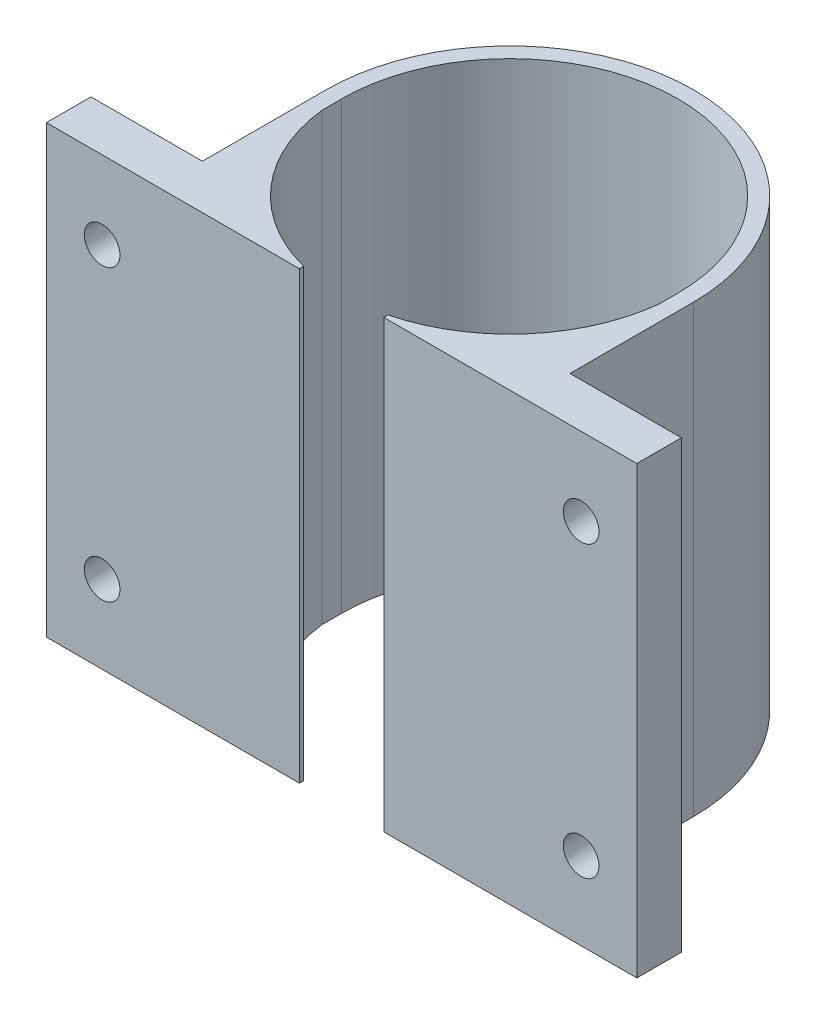
ISO-10303-21;
HEADER;
FILE_DESCRIPTION(('STEP AP214'),'2;1');
FILE_NAME('part.step','',(''),(''),'','','');
FILE_SCHEMA(('AUTOMOTIVE_DESIGN { 1 0 10303 214 1 1 1 1 }'));
ENDSEC;
DATA;
#1=APPLICATION_CONTEXT('core data for automotive mechanical design processes');
#2=APPLICATION_PROTOCOL_DEFINITION('international standard','automotive_design',2000,#1);
#3=PRODUCT_CONTEXT('',#1,'mechanical');
#4=PRODUCT('Part','Part','',(#3));
#5=PRODUCT_RELATED_PRODUCT_CATEGORY('part','',(#4));
#6=PRODUCT_DEFINITION_FORMATION('','',#4);
#7=PRODUCT_DEFINITION_CONTEXT('part definition',#1,'design');
#8=PRODUCT_DEFINITION('design','',#6,#7);
#9=PRODUCT_DEFINITION_SHAPE('','',#8);
#10=(LENGTH_UNIT() NAMED_UNIT(*) SI_UNIT(.MILLI.,.METRE.));
#11=(NAMED_UNIT(*) PLANE_ANGLE_UNIT() SI_UNIT($,.RADIAN.));
#12=(NAMED_UNIT(*) SI_UNIT($,.STERADIAN.) SOLID_ANGLE_UNIT());
#13=UNCERTAINTY_MEASURE_WITH_UNIT(LENGTH_MEASURE(1.E-05),#10,'distance_accuracy_value','');
#14=(GEOMETRIC_REPRESENTATION_CONTEXT(3) GLOBAL_UNCERTAINTY_ASSIGNED_CONTEXT((#13)) GLOBAL_UNIT_ASSIGNED_CONTEXT((#10,
#11,#12)) REPRESENTATION_CONTEXT('',''));
#15=CARTESIAN_POINT('',(0.,0.,0.));
#16=DIRECTION('',(0.,0.,1.));
#17=DIRECTION('',(1.,0.,0.));
#18=AXIS2_PLACEMENT_3D('',#15,#16,#17);
#19=CARTESIAN_POINT('',(-15.1,40.,0.));
#20=DIRECTION('',(1.,0.,0.));
#21=DIRECTION('',(0.,0.,-1.));
#22=AXIS2_PLACEMENT_3D('',#19,#20,#21);
#23=PLANE('',#22);
#24=DIRECTION('',(0.,0.,1.));
#25=VECTOR('',#24,1.);
#26=CARTESIAN_POINT('',(-15.1,40.,0.));
#27=LINE('',#26,#25);
#28=CARTESIAN_POINT('',(-15.1,40.,0.));
#29=VERTEX_POINT('',#28);
#30=CARTESIAN_POINT('',(-15.1,40.,1.74068951855294));
#31=VERTEX_POINT('',#30);
#32=EDGE_CURVE('E258',#29,#31,#27,.T.);
#33=ORIENTED_EDGE('',*,*,#32,.T.);
#34=DIRECTION('',(0.,-1.,0.));
#35=VECTOR('',#34,1.);
#36=CARTESIAN_POINT('',(-15.1,40.,1.74068951855294));
#37=LINE('',#36,#35);
#38=CARTESIAN_POINT('',(-15.1,0.,1.74068951855294));
#39=VERTEX_POINT('',#38);
#40=EDGE_CURVE('E180',#31,#39,#37,.T.);
#41=ORIENTED_EDGE('',*,*,#40,.T.);
#42=DIRECTION('',(0.,0.,1.));
#43=VECTOR('',#42,1.);
#44=CARTESIAN_POINT('',(-15.1,0.,0.));
#45=LINE('',#44,#43);
#46=CARTESIAN_POINT('',(-15.1,0.,0.));
#47=VERTEX_POINT('',#46);
#48=EDGE_CURVE('E275',#47,#39,#45,.T.);
#49=ORIENTED_EDGE('',*,*,#48,.F.);
#50=DIRECTION('',(0.,-1.,0.));
#51=VECTOR('',#50,1.);
#52=CARTESIAN_POINT('',(-15.1,40.,0.));
#53=LINE('',#52,#51);
#54=EDGE_CURVE('E284',#29,#47,#53,.T.);
#55=ORIENTED_EDGE('',*,*,#54,.F.);
#56=EDGE_LOOP('',(#33,#41,#49,#55));
#57=FACE_BOUND('',#56,.T.);
#58=ADVANCED_FACE('F45',(#57),#23,.T.);
#59=CARTESIAN_POINT('',(-16.5,40.,0.));
#60=DIRECTION('',(1.,0.,0.));
#61=DIRECTION('',(0.,0.,-1.));
#62=AXIS2_PLACEMENT_3D('',#59,#60,#61);
#63=PLANE('',#62);
#64=DIRECTION('',(0.,-1.,0.));
#65=VECTOR('',#64,1.);
#66=CARTESIAN_POINT('',(-16.5,40.,11.1));
#67=LINE('',#66,#65);
#68=CARTESIAN_POINT('',(-16.5,40.,11.1));
#69=VERTEX_POINT('',#68);
#70=CARTESIAN_POINT('',(-16.5,0.,11.1));
#71=VERTEX_POINT('',#70);
#72=EDGE_CURVE('E208',#69,#71,#67,.T.);
#73=ORIENTED_EDGE('',*,*,#72,.F.);
#74=DIRECTION('',(0.,0.,1.));
#75=VECTOR('',#74,1.);
#76=CARTESIAN_POINT('',(-16.5,40.,0.));
#77=LINE('',#76,#75);
#78=CARTESIAN_POINT('',(-16.5,40.,0.));
#79=VERTEX_POINT('',#78);
#80=EDGE_CURVE('E254',#79,#69,#77,.T.);
#81=ORIENTED_EDGE('',*,*,#80,.F.);
#82=DIRECTION('',(0.,-1.,0.));
#83=VECTOR('',#82,1.);
#84=CARTESIAN_POINT('',(-16.5,40.,0.));
#85=LINE('',#84,#83);
#86=CARTESIAN_POINT('',(-16.5,0.,0.));
#87=VERTEX_POINT('',#86);
#88=EDGE_CURVE('E53',#79,#87,#85,.T.);
#89=ORIENTED_EDGE('',*,*,#88,.T.);
#90=DIRECTION('',(0.,0.,1.));
#91=VECTOR('',#90,1.);
#92=CARTESIAN_POINT('',(-16.5,0.,0.));
#93=LINE('',#92,#91);
#94=EDGE_CURVE('E271',#87,#71,#93,.T.);
#95=ORIENTED_EDGE('',*,*,#94,.T.);
#96=EDGE_LOOP('',(#73,#81,#89,#95));
#97=FACE_BOUND('',#96,.T.);
#98=ADVANCED_FACE('F290',(#97),#63,.F.);
#99=CARTESIAN_POINT('',(16.5,40.,0.));
#100=DIRECTION('',(-1.,0.,0.));
#101=DIRECTION('',(0.,0.,1.));
#102=AXIS2_PLACEMENT_3D('',#99,#100,#101);
#103=PLANE('',#102);
#104=DIRECTION('',(0.,1.,0.));
#105=VECTOR('',#104,1.);
#106=CARTESIAN_POINT('',(16.5,0.,11.1));
#107=LINE('',#106,#105);
#108=CARTESIAN_POINT('',(16.5,0.,11.1));
#109=VERTEX_POINT('',#108);
#110=CARTESIAN_POINT('',(16.5,40.,11.1));
#111=VERTEX_POINT('',#110);
#112=EDGE_CURVE('E229',#109,#111,#107,.T.);
#113=ORIENTED_EDGE('',*,*,#112,.F.);
#114=DIRECTION('',(0.,0.,-1.));
#115=VECTOR('',#114,1.);
#116=CARTESIAN_POINT('',(16.5,0.,0.));
#117=LINE('',#116,#115);
#118=CARTESIAN_POINT('',(16.5,0.,0.));
#119=VERTEX_POINT('',#118);
#120=EDGE_CURVE('E248',#109,#119,#117,.T.);
#121=ORIENTED_EDGE('',*,*,#120,.T.);
#122=DIRECTION('',(0.,-1.,0.));
#123=VECTOR('',#122,1.);
#124=CARTESIAN_POINT('',(16.5,40.,0.));
#125=LINE('',#124,#123);
#126=CARTESIAN_POINT('',(16.5,40.,0.));
#127=VERTEX_POINT('',#126);
#128=EDGE_CURVE('E12',#127,#119,#125,.T.);
#129=ORIENTED_EDGE('',*,*,#128,.F.);
#130=DIRECTION('',(0.,0.,-1.));
#131=VECTOR('',#130,1.);
#132=CARTESIAN_POINT('',(16.5,40.,0.));
#133=LINE('',#132,#131);
#134=EDGE_CURVE('E249',#111,#127,#133,.T.);
#135=ORIENTED_EDGE('',*,*,#134,.F.);
#136=EDGE_LOOP('',(#113,#121,#129,#135));
#137=FACE_BOUND('',#136,.T.);
#138=ADVANCED_FACE('F47',(#137),#103,.F.);
#139=CARTESIAN_POINT('',(0.,40.,0.));
#140=DIRECTION('',(0.,-1.,0.));
#141=DIRECTION('',(0.,0.,-1.));
#142=AXIS2_PLACEMENT_3D('',#139,#140,#141);
#143=CYLINDRICAL_SURFACE('',#142,16.5);
#144=CARTESIAN_POINT('',(0.,0.,0.));
#145=DIRECTION('',(0.,1.,0.));
#146=DIRECTION('',(0.,0.,1.));
#147=AXIS2_PLACEMENT_3D('',#144,#145,#146);
#148=CIRCLE('',#147,16.5);
#149=EDGE_CURVE('E269',#119,#87,#148,.T.);
#150=ORIENTED_EDGE('',*,*,#149,.T.);
#151=ORIENTED_EDGE('',*,*,#88,.F.);
#152=CARTESIAN_POINT('',(0.,40.,0.));
#153=DIRECTION('',(0.,1.,0.));
#154=DIRECTION('',(0.,0.,1.));
#155=AXIS2_PLACEMENT_3D('',#152,#153,#154);
#156=CIRCLE('',#155,16.5);
#157=EDGE_CURVE('E251',#127,#79,#156,.T.);
#158=ORIENTED_EDGE('',*,*,#157,.F.);
#159=ORIENTED_EDGE('',*,*,#128,.T.);
#160=EDGE_LOOP('',(#150,#151,#158,#159));
#161=FACE_BOUND('',#160,.T.);
#162=ADVANCED_FACE('F303',(#161),#143,.T.);
#163=CARTESIAN_POINT('',(0.,40.,15.1));
#164=DIRECTION('',(0.,0.,1.));
#165=DIRECTION('',(1.,0.,0.));
#166=AXIS2_PLACEMENT_3D('',#163,#164,#165);
#167=PLANE('',#166);
#168=CARTESIAN_POINT('',(-21.5,7.,15.1));
#169=DIRECTION('',(0.,0.,1.));
#170=DIRECTION('',(1.,0.,0.));
#171=AXIS2_PLACEMENT_3D('',#168,#169,#170);
#172=CIRCLE('',#171,1.6);
#173=CARTESIAN_POINT('',(-19.9,7.,15.1));
#174=VERTEX_POINT('',#173);
#175=EDGE_CURVE('E402',#174,#174,#172,.T.);
#176=ORIENTED_EDGE('',*,*,#175,.F.);
#177=EDGE_LOOP('',(#176));
#178=FACE_BOUND('',#177,.T.);
#179=CARTESIAN_POINT('',(-21.5,33.,15.1));
#180=DIRECTION('',(0.,0.,1.));
#181=DIRECTION('',(1.,0.,0.));
#182=AXIS2_PLACEMENT_3D('',#179,#180,#181);
#183=CIRCLE('',#182,1.6);
#184=CARTESIAN_POINT('',(-19.9,33.,15.1));
#185=VERTEX_POINT('',#184);
#186=EDGE_CURVE('E410',#185,#185,#183,.T.);
#187=ORIENTED_EDGE('',*,*,#186,.F.);
#188=EDGE_LOOP('',(#187));
#189=FACE_BOUND('',#188,.T.);
#190=DIRECTION('',(-1.,0.,0.));
#191=VECTOR('',#190,1.);
#192=CARTESIAN_POINT('',(0.,0.,15.1));
#193=LINE('',#192,#191);
#194=CARTESIAN_POINT('',(-3.79133270865897,0.,15.1));
#195=VERTEX_POINT('',#194);
#196=CARTESIAN_POINT('',(-26.5,0.,15.1));
#197=VERTEX_POINT('',#196);
#198=EDGE_CURVE('E273',#195,#197,#193,.T.);
#199=ORIENTED_EDGE('',*,*,#198,.F.);
#200=DIRECTION('',(0.,-1.,0.));
#201=VECTOR('',#200,1.);
#202=CARTESIAN_POINT('',(-3.79133270865897,40.,15.1));
#203=LINE('',#202,#201);
#204=CARTESIAN_POINT('',(-3.79133270865897,40.,15.1));
#205=VERTEX_POINT('',#204);
#206=EDGE_CURVE('E176',#205,#195,#203,.T.);
#207=ORIENTED_EDGE('',*,*,#206,.F.);
#208=DIRECTION('',(-1.,0.,0.));
#209=VECTOR('',#208,1.);
#210=CARTESIAN_POINT('',(0.,40.,15.1));
#211=LINE('',#210,#209);
#212=CARTESIAN_POINT('',(-26.5,40.,15.1));
#213=VERTEX_POINT('',#212);
#214=EDGE_CURVE('E164',#205,#213,#211,.T.);
#215=ORIENTED_EDGE('',*,*,#214,.T.);
#216=DIRECTION('',(0.,1.,0.));
#217=VECTOR('',#216,1.);
#218=CARTESIAN_POINT('',(-26.5,40.,15.1));
#219=LINE('',#218,#217);
#220=EDGE_CURVE('E211',#197,#213,#219,.T.);
#221=ORIENTED_EDGE('',*,*,#220,.F.);
#222=EDGE_LOOP('',(#199,#207,#215,#221));
#223=FACE_BOUND('',#222,.T.);
#224=ADVANCED_FACE('F338',(#178,#189,#223),#167,.T.);
#225=CARTESIAN_POINT('',(0.,40.,0.));
#226=DIRECTION('',(0.,-1.,0.));
#227=DIRECTION('',(0.,0.,-1.));
#228=AXIS2_PLACEMENT_3D('',#225,#226,#227);
#229=CYLINDRICAL_SURFACE('',#228,15.1);
#230=CARTESIAN_POINT('',(0.,0.,0.));
#231=DIRECTION('',(0.,1.,0.));
#232=DIRECTION('',(0.,0.,1.));
#233=AXIS2_PLACEMENT_3D('',#230,#231,#232);
#234=CIRCLE('',#233,15.1);
#235=CARTESIAN_POINT('',(15.1,0.,0.));
#236=VERTEX_POINT('',#235);
#237=EDGE_CURVE('E278',#236,#47,#234,.T.);
#238=ORIENTED_EDGE('',*,*,#237,.F.);
#239=DIRECTION('',(0.,-1.,0.));
#240=VECTOR('',#239,1.);
#241=CARTESIAN_POINT('',(15.1,40.,0.));
#242=LINE('',#241,#240);
#243=CARTESIAN_POINT('',(15.1,40.,0.));
#244=VERTEX_POINT('',#243);
#245=EDGE_CURVE('E267',#244,#236,#242,.T.);
#246=ORIENTED_EDGE('',*,*,#245,.F.);
#247=CARTESIAN_POINT('',(0.,40.,0.));
#248=DIRECTION('',(0.,1.,0.));
#249=DIRECTION('',(0.,0.,1.));
#250=AXIS2_PLACEMENT_3D('',#247,#248,#249);
#251=CIRCLE('',#250,15.1);
#252=EDGE_CURVE('E260',#244,#29,#251,.T.);
#253=ORIENTED_EDGE('',*,*,#252,.T.);
#254=ORIENTED_EDGE('',*,*,#54,.T.);
#255=EDGE_LOOP('',(#238,#246,#253,#254));
#256=FACE_BOUND('',#255,.T.);
#257=ADVANCED_FACE('F331',(#256),#229,.F.);
#258=CARTESIAN_POINT('',(15.1,40.,0.));
#259=DIRECTION('',(1.,0.,0.));
#260=DIRECTION('',(0.,0.,-1.));
#261=AXIS2_PLACEMENT_3D('',#258,#259,#260);
#262=PLANE('',#261);
#263=DIRECTION('',(0.,0.,1.));
#264=VECTOR('',#263,1.);
#265=CARTESIAN_POINT('',(15.1,0.,0.));
#266=LINE('',#265,#264);
#267=CARTESIAN_POINT('',(15.1,0.,1.74068951855292));
#268=VERTEX_POINT('',#267);
#269=EDGE_CURVE('E65',#236,#268,#266,.T.);
#270=ORIENTED_EDGE('',*,*,#269,.T.);
#271=DIRECTION('',(0.,-1.,0.));
#272=VECTOR('',#271,1.);
#273=CARTESIAN_POINT('',(15.1,40.,1.74068951855294));
#274=LINE('',#273,#272);
#275=CARTESIAN_POINT('',(15.1,40.,1.74068951855292));
#276=VERTEX_POINT('',#275);
#277=EDGE_CURVE('E60',#276,#268,#274,.T.);
#278=ORIENTED_EDGE('',*,*,#277,.F.);
#279=DIRECTION('',(0.,0.,1.));
#280=VECTOR('',#279,1.);
#281=CARTESIAN_POINT('',(15.1,40.,0.));
#282=LINE('',#281,#280);
#283=EDGE_CURVE('E263',#244,#276,#282,.T.);
#284=ORIENTED_EDGE('',*,*,#283,.F.);
#285=ORIENTED_EDGE('',*,*,#245,.T.);
#286=EDGE_LOOP('',(#270,#278,#284,#285));
#287=FACE_BOUND('',#286,.T.);
#288=ADVANCED_FACE('F328',(#287),#262,.F.);
#289=CARTESIAN_POINT('',(0.,40.,15.1));
#290=DIRECTION('',(0.,0.,-1.));
#291=DIRECTION('',(-1.,0.,0.));
#292=AXIS2_PLACEMENT_3D('',#289,#290,#291);
#293=PLANE('',#292);
#294=CARTESIAN_POINT('',(21.5,33.,15.1));
#295=DIRECTION('',(0.,0.,-1.));
#296=DIRECTION('',(-1.,0.,0.));
#297=AXIS2_PLACEMENT_3D('',#294,#295,#296);
#298=CIRCLE('',#297,1.6);
#299=CARTESIAN_POINT('',(19.9,33.,15.1));
#300=VERTEX_POINT('',#299);
#301=EDGE_CURVE('E186',#300,#300,#298,.T.);
#302=ORIENTED_EDGE('',*,*,#301,.T.);
#303=EDGE_LOOP('',(#302));
#304=FACE_BOUND('',#303,.T.);
#305=CARTESIAN_POINT('',(21.5,7.,15.1));
#306=DIRECTION('',(0.,0.,-1.));
#307=DIRECTION('',(-1.,0.,0.));
#308=AXIS2_PLACEMENT_3D('',#305,#306,#307);
#309=CIRCLE('',#308,1.6);
#310=CARTESIAN_POINT('',(19.9,7.,15.1));
#311=VERTEX_POINT('',#310);
#312=EDGE_CURVE('E420',#311,#311,#309,.T.);
#313=ORIENTED_EDGE('',*,*,#312,.T.);
#314=EDGE_LOOP('',(#313));
#315=FACE_BOUND('',#314,.T.);
#316=DIRECTION('',(1.,0.,0.));
#317=VECTOR('',#316,1.);
#318=CARTESIAN_POINT('',(0.,0.,15.1));
#319=LINE('',#318,#317);
#320=CARTESIAN_POINT('',(3.79133270865898,0.,15.1));
#321=VERTEX_POINT('',#320);
#322=CARTESIAN_POINT('',(26.5,0.,15.1));
#323=VERTEX_POINT('',#322);
#324=EDGE_CURVE('E252',#321,#323,#319,.T.);
#325=ORIENTED_EDGE('',*,*,#324,.T.);
#326=DIRECTION('',(0.,-1.,0.));
#327=VECTOR('',#326,1.);
#328=CARTESIAN_POINT('',(26.5,0.,15.1));
#329=LINE('',#328,#327);
#330=CARTESIAN_POINT('',(26.5,40.,15.1));
#331=VERTEX_POINT('',#330);
#332=EDGE_CURVE('E230',#331,#323,#329,.T.);
#333=ORIENTED_EDGE('',*,*,#332,.F.);
#334=DIRECTION('',(1.,0.,0.));
#335=VECTOR('',#334,1.);
#336=CARTESIAN_POINT('',(0.,40.,15.1));
#337=LINE('',#336,#335);
#338=CARTESIAN_POINT('',(3.79133270865898,40.,15.1));
#339=VERTEX_POINT('',#338);
#340=EDGE_CURVE('E265',#339,#331,#337,.T.);
#341=ORIENTED_EDGE('',*,*,#340,.F.);
#342=DIRECTION('',(0.,-1.,0.));
#343=VECTOR('',#342,1.);
#344=CARTESIAN_POINT('',(3.79133270865898,40.,15.1));
#345=LINE('',#344,#343);
#346=EDGE_CURVE('E205',#339,#321,#345,.T.);
#347=ORIENTED_EDGE('',*,*,#346,.T.);
#348=EDGE_LOOP('',(#325,#333,#341,#347));
#349=FACE_BOUND('',#348,.T.);
#350=ADVANCED_FACE('F317',(#304,#315,#349),#293,.F.);
#351=CARTESIAN_POINT('',(0.,40.,0.));
#352=DIRECTION('',(0.,1.,0.));
#353=DIRECTION('',(0.,0.,1.));
#354=AXIS2_PLACEMENT_3D('',#351,#352,#353);
#355=PLANE('',#354);
#356=ORIENTED_EDGE('',*,*,#340,.T.);
#357=DIRECTION('',(0.,0.,1.));
#358=VECTOR('',#357,1.);
#359=CARTESIAN_POINT('',(26.5,40.,15.1));
#360=LINE('',#359,#358);
#361=CARTESIAN_POINT('',(26.5,40.,11.1));
#362=VERTEX_POINT('',#361);
#363=EDGE_CURVE('E237',#362,#331,#360,.T.);
#364=ORIENTED_EDGE('',*,*,#363,.F.);
#365=DIRECTION('',(-1.,0.,0.));
#366=VECTOR('',#365,1.);
#367=CARTESIAN_POINT('',(26.5,40.,11.1));
#368=LINE('',#367,#366);
#369=EDGE_CURVE('E240',#362,#111,#368,.T.);
#370=ORIENTED_EDGE('',*,*,#369,.T.);
#371=ORIENTED_EDGE('',*,*,#134,.T.);
#372=ORIENTED_EDGE('',*,*,#157,.T.);
#373=ORIENTED_EDGE('',*,*,#80,.T.);
#374=DIRECTION('',(1.,0.,0.));
#375=VECTOR('',#374,1.);
#376=CARTESIAN_POINT('',(-26.5,40.,11.1));
#377=LINE('',#376,#375);
#378=CARTESIAN_POINT('',(-26.5,40.,11.1));
#379=VERTEX_POINT('',#378);
#380=EDGE_CURVE('E226',#379,#69,#377,.T.);
#381=ORIENTED_EDGE('',*,*,#380,.F.);
#382=DIRECTION('',(0.,0.,-1.));
#383=VECTOR('',#382,1.);
#384=CARTESIAN_POINT('',(-26.5,40.,15.1));
#385=LINE('',#384,#383);
#386=EDGE_CURVE('E214',#213,#379,#385,.T.);
#387=ORIENTED_EDGE('',*,*,#386,.F.);
#388=ORIENTED_EDGE('',*,*,#214,.F.);
#389=DIRECTION('',(0.,0.,-1.));
#390=VECTOR('',#389,1.);
#391=CARTESIAN_POINT('',(-3.79133270865897,40.,0.));
#392=LINE('',#391,#390);
#393=CARTESIAN_POINT('',(-3.79133270865897,40.,14.7195718787012));
#394=VERTEX_POINT('',#393);
#395=EDGE_CURVE('E156',#205,#394,#392,.T.);
#396=ORIENTED_EDGE('',*,*,#395,.T.);
#397=CARTESIAN_POINT('',(0.,40.,0.));
#398=DIRECTION('',(0.,-1.,0.));
#399=DIRECTION('',(0.,0.,-1.));
#400=AXIS2_PLACEMENT_3D('',#397,#398,#399);
#401=CIRCLE('',#400,15.2);
#402=EDGE_CURVE('E161',#394,#31,#401,.T.);
#403=ORIENTED_EDGE('',*,*,#402,.T.);
#404=ORIENTED_EDGE('',*,*,#32,.F.);
#405=ORIENTED_EDGE('',*,*,#252,.F.);
#406=ORIENTED_EDGE('',*,*,#283,.T.);
#407=CARTESIAN_POINT('',(0.,40.,0.));
#408=DIRECTION('',(0.,-1.,0.));
#409=DIRECTION('',(0.,0.,-1.));
#410=AXIS2_PLACEMENT_3D('',#407,#408,#409);
#411=CIRCLE('',#410,15.2);
#412=CARTESIAN_POINT('',(3.79133270865898,40.,14.7195718787012));
#413=VERTEX_POINT('',#412);
#414=EDGE_CURVE('E196',#413,#276,#411,.F.);
#415=ORIENTED_EDGE('',*,*,#414,.F.);
#416=DIRECTION('',(0.,0.,-1.));
#417=VECTOR('',#416,1.);
#418=CARTESIAN_POINT('',(3.79133270865898,40.,0.));
#419=LINE('',#418,#417);
#420=EDGE_CURVE('E193',#339,#413,#419,.T.);
#421=ORIENTED_EDGE('',*,*,#420,.F.);
#422=EDGE_LOOP('',(#356,#364,#370,#371,#372,#373,#381,#387,#388,#396,#403,#404,#405,#406,#415,#421));
#423=FACE_BOUND('',#422,.T.);
#424=ADVANCED_FACE('F158',(#423),#355,.T.);
#425=CARTESIAN_POINT('',(0.,0.,0.));
#426=DIRECTION('',(0.,1.,0.));
#427=DIRECTION('',(0.,0.,1.));
#428=AXIS2_PLACEMENT_3D('',#425,#426,#427);
#429=PLANE('',#428);
#430=ORIENTED_EDGE('',*,*,#120,.F.);
#431=DIRECTION('',(-1.,0.,0.));
#432=VECTOR('',#431,1.);
#433=CARTESIAN_POINT('',(26.5,0.,11.1));
#434=LINE('',#433,#432);
#435=CARTESIAN_POINT('',(26.5,0.,11.1));
#436=VERTEX_POINT('',#435);
#437=EDGE_CURVE('E245',#436,#109,#434,.T.);
#438=ORIENTED_EDGE('',*,*,#437,.F.);
#439=DIRECTION('',(0.,0.,-1.));
#440=VECTOR('',#439,1.);
#441=CARTESIAN_POINT('',(26.5,0.,15.1));
#442=LINE('',#441,#440);
#443=EDGE_CURVE('E233',#323,#436,#442,.T.);
#444=ORIENTED_EDGE('',*,*,#443,.F.);
#445=ORIENTED_EDGE('',*,*,#324,.F.);
#446=DIRECTION('',(0.,0.,-1.));
#447=VECTOR('',#446,1.);
#448=CARTESIAN_POINT('',(3.79133270865898,0.,0.));
#449=LINE('',#448,#447);
#450=CARTESIAN_POINT('',(3.79133270865898,0.,14.7195718787012));
#451=VERTEX_POINT('',#450);
#452=EDGE_CURVE('E191',#321,#451,#449,.T.);
#453=ORIENTED_EDGE('',*,*,#452,.T.);
#454=CARTESIAN_POINT('',(0.,0.,0.));
#455=DIRECTION('',(0.,-1.,0.));
#456=DIRECTION('',(0.,0.,-1.));
#457=AXIS2_PLACEMENT_3D('',#454,#455,#456);
#458=CIRCLE('',#457,15.2);
#459=EDGE_CURVE('E197',#451,#268,#458,.F.);
#460=ORIENTED_EDGE('',*,*,#459,.T.);
#461=ORIENTED_EDGE('',*,*,#269,.F.);
#462=ORIENTED_EDGE('',*,*,#237,.T.);
#463=ORIENTED_EDGE('',*,*,#48,.T.);
#464=CARTESIAN_POINT('',(0.,0.,0.));
#465=DIRECTION('',(0.,-1.,0.));
#466=DIRECTION('',(0.,0.,-1.));
#467=AXIS2_PLACEMENT_3D('',#464,#465,#466);
#468=CIRCLE('',#467,15.2);
#469=CARTESIAN_POINT('',(-3.79133270865897,0.,14.7195718787012));
#470=VERTEX_POINT('',#469);
#471=EDGE_CURVE('E183',#470,#39,#468,.T.);
#472=ORIENTED_EDGE('',*,*,#471,.F.);
#473=DIRECTION('',(0.,0.,-1.));
#474=VECTOR('',#473,1.);
#475=CARTESIAN_POINT('',(-3.79133270865897,0.,0.));
#476=LINE('',#475,#474);
#477=EDGE_CURVE('E173',#195,#470,#476,.T.);
#478=ORIENTED_EDGE('',*,*,#477,.F.);
#479=ORIENTED_EDGE('',*,*,#198,.T.);
#480=DIRECTION('',(0.,0.,1.));
#481=VECTOR('',#480,1.);
#482=CARTESIAN_POINT('',(-26.5,0.,15.1));
#483=LINE('',#482,#481);
#484=CARTESIAN_POINT('',(-26.5,0.,11.1));
#485=VERTEX_POINT('',#484);
#486=EDGE_CURVE('E218',#485,#197,#483,.T.);
#487=ORIENTED_EDGE('',*,*,#486,.F.);
#488=DIRECTION('',(1.,0.,0.));
#489=VECTOR('',#488,1.);
#490=CARTESIAN_POINT('',(-26.5,0.,11.1));
#491=LINE('',#490,#489);
#492=EDGE_CURVE('E221',#485,#71,#491,.T.);
#493=ORIENTED_EDGE('',*,*,#492,.T.);
#494=ORIENTED_EDGE('',*,*,#94,.F.);
#495=ORIENTED_EDGE('',*,*,#149,.F.);
#496=EDGE_LOOP('',(#430,#438,#444,#445,#453,#460,#461,#462,#463,#472,#478,#479,#487,#493,#494,#495));
#497=FACE_BOUND('',#496,.T.);
#498=ADVANCED_FACE('F295',(#497),#429,.F.);
#499=CARTESIAN_POINT('',(26.5,0.,11.1));
#500=DIRECTION('',(0.,0.,1.));
#501=DIRECTION('',(1.,0.,0.));
#502=AXIS2_PLACEMENT_3D('',#499,#500,#501);
#503=PLANE('',#502);
#504=CARTESIAN_POINT('',(21.5,33.,11.1));
#505=DIRECTION('',(0.,0.,-1.));
#506=DIRECTION('',(-1.,0.,0.));
#507=AXIS2_PLACEMENT_3D('',#504,#505,#506);
#508=CIRCLE('',#507,1.6);
#509=CARTESIAN_POINT('',(19.9,33.,11.1));
#510=VERTEX_POINT('',#509);
#511=EDGE_CURVE('E413',#510,#510,#508,.T.);
#512=ORIENTED_EDGE('',*,*,#511,.F.);
#513=EDGE_LOOP('',(#512));
#514=FACE_BOUND('',#513,.T.);
#515=CARTESIAN_POINT('',(21.5,7.,11.1));
#516=DIRECTION('',(0.,0.,-1.));
#517=DIRECTION('',(-1.,0.,0.));
#518=AXIS2_PLACEMENT_3D('',#515,#516,#517);
#519=CIRCLE('',#518,1.6);
#520=CARTESIAN_POINT('',(19.9,7.,11.1));
#521=VERTEX_POINT('',#520);
#522=EDGE_CURVE('E407',#521,#521,#519,.T.);
#523=ORIENTED_EDGE('',*,*,#522,.F.);
#524=EDGE_LOOP('',(#523));
#525=FACE_BOUND('',#524,.T.);
#526=ORIENTED_EDGE('',*,*,#112,.T.);
#527=ORIENTED_EDGE('',*,*,#369,.F.);
#528=DIRECTION('',(0.,1.,0.));
#529=VECTOR('',#528,1.);
#530=CARTESIAN_POINT('',(26.5,0.,11.1));
#531=LINE('',#530,#529);
#532=EDGE_CURVE('E235',#436,#362,#531,.T.);
#533=ORIENTED_EDGE('',*,*,#532,.F.);
#534=ORIENTED_EDGE('',*,*,#437,.T.);
#535=EDGE_LOOP('',(#526,#527,#533,#534));
#536=FACE_BOUND('',#535,.T.);
#537=ADVANCED_FACE('F311',(#514,#525,#536),#503,.F.);
#538=CARTESIAN_POINT('',(26.5,0.,0.));
#539=DIRECTION('',(-1.,0.,0.));
#540=DIRECTION('',(0.,0.,1.));
#541=AXIS2_PLACEMENT_3D('',#538,#539,#540);
#542=PLANE('',#541);
#543=ORIENTED_EDGE('',*,*,#332,.T.);
#544=ORIENTED_EDGE('',*,*,#443,.T.);
#545=ORIENTED_EDGE('',*,*,#532,.T.);
#546=ORIENTED_EDGE('',*,*,#363,.T.);
#547=EDGE_LOOP('',(#543,#544,#545,#546));
#548=FACE_BOUND('',#547,.T.);
#549=ADVANCED_FACE('F314',(#548),#542,.F.);
#550=CARTESIAN_POINT('',(-26.5,40.,11.1));
#551=DIRECTION('',(0.,0.,1.));
#552=DIRECTION('',(0.,-1.,0.));
#553=AXIS2_PLACEMENT_3D('',#550,#551,#552);
#554=PLANE('',#553);
#555=CARTESIAN_POINT('',(-21.5,7.,11.1));
#556=DIRECTION('',(0.,0.,-1.));
#557=DIRECTION('',(-1.,0.,0.));
#558=AXIS2_PLACEMENT_3D('',#555,#556,#557);
#559=CIRCLE('',#558,1.6);
#560=CARTESIAN_POINT('',(-23.1,7.,11.1));
#561=VERTEX_POINT('',#560);
#562=EDGE_CURVE('E405',#561,#561,#559,.T.);
#563=ORIENTED_EDGE('',*,*,#562,.F.);
#564=EDGE_LOOP('',(#563));
#565=FACE_BOUND('',#564,.T.);
#566=CARTESIAN_POINT('',(-21.5,33.,11.1));
#567=DIRECTION('',(0.,0.,-1.));
#568=DIRECTION('',(-1.,0.,0.));
#569=AXIS2_PLACEMENT_3D('',#566,#567,#568);
#570=CIRCLE('',#569,1.6);
#571=CARTESIAN_POINT('',(-23.1,33.,11.1));
#572=VERTEX_POINT('',#571);
#573=EDGE_CURVE('E406',#572,#572,#570,.T.);
#574=ORIENTED_EDGE('',*,*,#573,.F.);
#575=EDGE_LOOP('',(#574));
#576=FACE_BOUND('',#575,.T.);
#577=ORIENTED_EDGE('',*,*,#72,.T.);
#578=ORIENTED_EDGE('',*,*,#492,.F.);
#579=DIRECTION('',(0.,-1.,0.));
#580=VECTOR('',#579,1.);
#581=CARTESIAN_POINT('',(-26.5,40.,11.1));
#582=LINE('',#581,#580);
#583=EDGE_CURVE('E216',#379,#485,#582,.T.);
#584=ORIENTED_EDGE('',*,*,#583,.F.);
#585=ORIENTED_EDGE('',*,*,#380,.T.);
#586=EDGE_LOOP('',(#577,#578,#584,#585));
#587=FACE_BOUND('',#586,.T.);
#588=ADVANCED_FACE('F300',(#565,#576,#587),#554,.F.);
#589=CARTESIAN_POINT('',(-26.5,0.,0.));
#590=DIRECTION('',(1.,0.,0.));
#591=DIRECTION('',(0.,0.,-1.));
#592=AXIS2_PLACEMENT_3D('',#589,#590,#591);
#593=PLANE('',#592);
#594=ORIENTED_EDGE('',*,*,#220,.T.);
#595=ORIENTED_EDGE('',*,*,#386,.T.);
#596=ORIENTED_EDGE('',*,*,#583,.T.);
#597=ORIENTED_EDGE('',*,*,#486,.T.);
#598=EDGE_LOOP('',(#594,#595,#596,#597));
#599=FACE_BOUND('',#598,.T.);
#600=ADVANCED_FACE('F337',(#599),#593,.F.);
#601=CARTESIAN_POINT('',(3.79133270865898,40.,0.));
#602=DIRECTION('',(-1.,0.,0.));
#603=DIRECTION('',(0.,0.,1.));
#604=AXIS2_PLACEMENT_3D('',#601,#602,#603);
#605=PLANE('',#604);
#606=ORIENTED_EDGE('',*,*,#452,.F.);
#607=ORIENTED_EDGE('',*,*,#346,.F.);
#608=ORIENTED_EDGE('',*,*,#420,.T.);
#609=DIRECTION('',(0.,-1.,0.));
#610=VECTOR('',#609,1.);
#611=CARTESIAN_POINT('',(3.79133270865898,40.,14.7195718787012));
#612=LINE('',#611,#610);
#613=EDGE_CURVE('E200',#413,#451,#612,.T.);
#614=ORIENTED_EDGE('',*,*,#613,.T.);
#615=EDGE_LOOP('',(#606,#607,#608,#614));
#616=FACE_BOUND('',#615,.T.);
#617=ADVANCED_FACE('F322',(#616),#605,.T.);
#618=CARTESIAN_POINT('',(0.,40.,0.));
#619=DIRECTION('',(0.,-1.,0.));
#620=DIRECTION('',(0.,0.,-1.));
#621=AXIS2_PLACEMENT_3D('',#618,#619,#620);
#622=CYLINDRICAL_SURFACE('',#621,15.2);
#623=ORIENTED_EDGE('',*,*,#459,.F.);
#624=ORIENTED_EDGE('',*,*,#613,.F.);
#625=ORIENTED_EDGE('',*,*,#414,.T.);
#626=ORIENTED_EDGE('',*,*,#277,.T.);
#627=EDGE_LOOP('',(#623,#624,#625,#626));
#628=FACE_BOUND('',#627,.T.);
#629=ADVANCED_FACE('F326',(#628),#622,.F.);
#630=CARTESIAN_POINT('',(0.,40.,0.));
#631=DIRECTION('',(0.,-1.,0.));
#632=DIRECTION('',(0.,0.,-1.));
#633=AXIS2_PLACEMENT_3D('',#630,#631,#632);
#634=CYLINDRICAL_SURFACE('',#633,15.2);
#635=ORIENTED_EDGE('',*,*,#471,.T.);
#636=ORIENTED_EDGE('',*,*,#40,.F.);
#637=ORIENTED_EDGE('',*,*,#402,.F.);
#638=DIRECTION('',(0.,-1.,0.));
#639=VECTOR('',#638,1.);
#640=CARTESIAN_POINT('',(-3.79133270865897,40.,14.7195718787012));
#641=LINE('',#640,#639);
#642=EDGE_CURVE('E168',#394,#470,#641,.T.);
#643=ORIENTED_EDGE('',*,*,#642,.T.);
#644=EDGE_LOOP('',(#635,#636,#637,#643));
#645=FACE_BOUND('',#644,.T.);
#646=ADVANCED_FACE('F178',(#645),#634,.F.);
#647=CARTESIAN_POINT('',(-3.79133270865897,40.,0.));
#648=DIRECTION('',(-1.,0.,0.));
#649=DIRECTION('',(0.,0.,1.));
#650=AXIS2_PLACEMENT_3D('',#647,#648,#649);
#651=PLANE('',#650);
#652=ORIENTED_EDGE('',*,*,#477,.T.);
#653=ORIENTED_EDGE('',*,*,#642,.F.);
#654=ORIENTED_EDGE('',*,*,#395,.F.);
#655=ORIENTED_EDGE('',*,*,#206,.T.);
#656=EDGE_LOOP('',(#652,#653,#654,#655));
#657=FACE_BOUND('',#656,.T.);
#658=ADVANCED_FACE('F171',(#657),#651,.F.);
#659=CARTESIAN_POINT('',(-21.5,33.,51.1));
#660=DIRECTION('',(0.,0.,-1.));
#661=DIRECTION('',(-1.,0.,0.));
#662=AXIS2_PLACEMENT_3D('',#659,#660,#661);
#663=CYLINDRICAL_SURFACE('',#662,1.6);
#664=ORIENTED_EDGE('',*,*,#186,.T.);
#665=EDGE_LOOP('',(#664));
#666=FACE_BOUND('',#665,.T.);
#667=ORIENTED_EDGE('',*,*,#573,.T.);
#668=EDGE_LOOP('',(#667));
#669=FACE_BOUND('',#668,.T.);
#670=ADVANCED_FACE('F383',(#666,#669),#663,.F.);
#671=CARTESIAN_POINT('',(-21.5,7.,51.1));
#672=DIRECTION('',(0.,0.,-1.));
#673=DIRECTION('',(-1.,0.,0.));
#674=AXIS2_PLACEMENT_3D('',#671,#672,#673);
#675=CYLINDRICAL_SURFACE('',#674,1.6);
#676=ORIENTED_EDGE('',*,*,#175,.T.);
#677=EDGE_LOOP('',(#676));
#678=FACE_BOUND('',#677,.T.);
#679=ORIENTED_EDGE('',*,*,#562,.T.);
#680=EDGE_LOOP('',(#679));
#681=FACE_BOUND('',#680,.T.);
#682=ADVANCED_FACE('F386',(#678,#681),#675,.F.);
#683=CARTESIAN_POINT('',(21.5,7.,51.1));
#684=DIRECTION('',(0.,0.,-1.));
#685=DIRECTION('',(-1.,0.,0.));
#686=AXIS2_PLACEMENT_3D('',#683,#684,#685);
#687=CYLINDRICAL_SURFACE('',#686,1.6);
#688=ORIENTED_EDGE('',*,*,#522,.T.);
#689=EDGE_LOOP('',(#688));
#690=FACE_BOUND('',#689,.T.);
#691=ORIENTED_EDGE('',*,*,#312,.F.);
#692=EDGE_LOOP('',(#691));
#693=FACE_BOUND('',#692,.T.);
#694=ADVANCED_FACE('F391',(#690,#693),#687,.F.);
#695=CARTESIAN_POINT('',(21.5,33.,51.1));
#696=DIRECTION('',(0.,0.,-1.));
#697=DIRECTION('',(-1.,0.,0.));
#698=AXIS2_PLACEMENT_3D('',#695,#696,#697);
#699=CYLINDRICAL_SURFACE('',#698,1.6);
#700=ORIENTED_EDGE('',*,*,#511,.T.);
#701=EDGE_LOOP('',(#700));
#702=FACE_BOUND('',#701,.T.);
#703=ORIENTED_EDGE('',*,*,#301,.F.);
#704=EDGE_LOOP('',(#703));
#705=FACE_BOUND('',#704,.T.);
#706=ADVANCED_FACE('F388',(#702,#705),#699,.F.);
#707=CLOSED_SHELL('',(#58,#98,#138,#162,#224,#257,#288,#350,#424,#498,#537,#549,#588,#600,#617,
#629,#646,#658,#670,#682,#694,#706));
#708=MANIFOLD_SOLID_BREP('B2',#707);
#709=ADVANCED_BREP_SHAPE_REPRESENTATION('',(#18,#708),#14);
#710=SHAPE_DEFINITION_REPRESENTATION(#9,#709);
ENDSEC;
END-ISO-10303-21;
